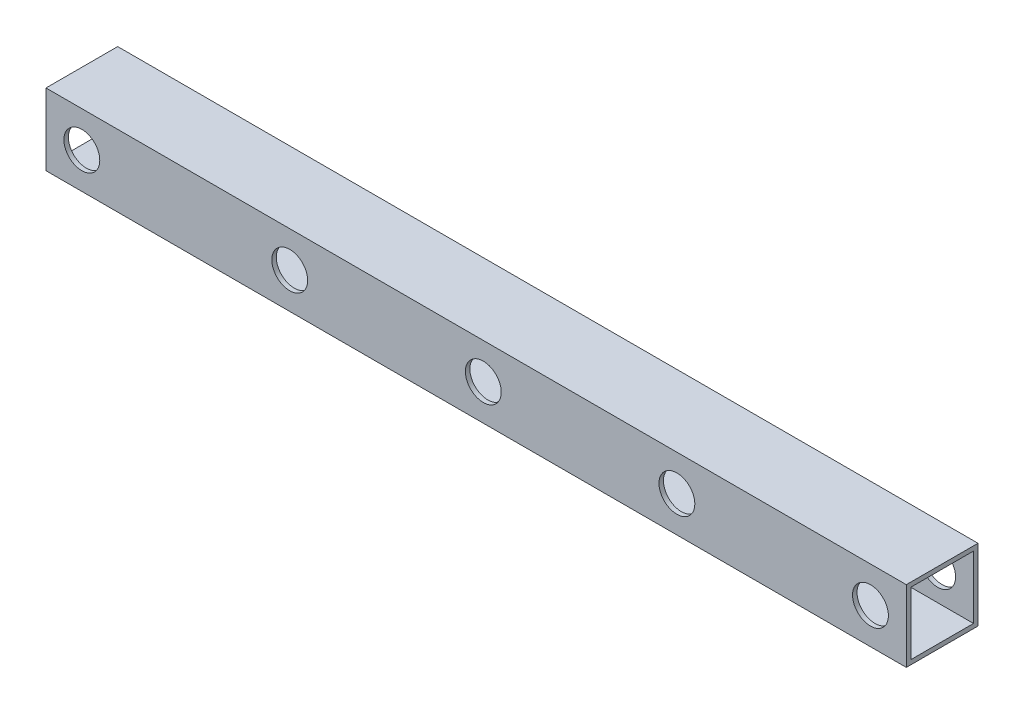
ISO-10303-21;
HEADER;
FILE_DESCRIPTION(('STEP AP214'),'2;1');
FILE_NAME('part.step','',(''),(''),'','','');
FILE_SCHEMA(('AUTOMOTIVE_DESIGN { 1 0 10303 214 1 1 1 1 }'));
ENDSEC;
DATA;
#1=APPLICATION_CONTEXT('core data for automotive mechanical design processes');
#2=APPLICATION_PROTOCOL_DEFINITION('international standard','automotive_design',2000,#1);
#3=PRODUCT_CONTEXT('',#1,'mechanical');
#4=PRODUCT('Part','Part','',(#3));
#5=PRODUCT_RELATED_PRODUCT_CATEGORY('part','',(#4));
#6=PRODUCT_DEFINITION_FORMATION('','',#4);
#7=PRODUCT_DEFINITION_CONTEXT('part definition',#1,'design');
#8=PRODUCT_DEFINITION('design','',#6,#7);
#9=PRODUCT_DEFINITION_SHAPE('','',#8);
#10=(LENGTH_UNIT() NAMED_UNIT(*) SI_UNIT(.MILLI.,.METRE.));
#11=(NAMED_UNIT(*) PLANE_ANGLE_UNIT() SI_UNIT($,.RADIAN.));
#12=(NAMED_UNIT(*) SI_UNIT($,.STERADIAN.) SOLID_ANGLE_UNIT());
#13=UNCERTAINTY_MEASURE_WITH_UNIT(LENGTH_MEASURE(1.E-05),#10,'distance_accuracy_value','');
#14=(GEOMETRIC_REPRESENTATION_CONTEXT(3) GLOBAL_UNCERTAINTY_ASSIGNED_CONTEXT((#13)) GLOBAL_UNIT_ASSIGNED_CONTEXT((#10,
#11,#12)) REPRESENTATION_CONTEXT('',''));
#15=CARTESIAN_POINT('',(0.,0.,0.));
#16=DIRECTION('',(0.,0.,1.));
#17=DIRECTION('',(1.,0.,0.));
#18=AXIS2_PLACEMENT_3D('',#15,#16,#17);
#19=CARTESIAN_POINT('',(304.8,-1.5875,-23.8125));
#20=DIRECTION('',(0.,0.,-1.));
#21=DIRECTION('',(-1.,0.,0.));
#22=AXIS2_PLACEMENT_3D('',#19,#20,#21);
#23=PLANE('',#22);
#24=CARTESIAN_POINT('',(154.94,-12.7,-23.8125));
#25=DIRECTION('',(0.,0.,1.));
#26=DIRECTION('',(1.,0.,0.));
#27=AXIS2_PLACEMENT_3D('',#24,#25,#26);
#28=CIRCLE('',#27,6.35000000000002);
#29=CARTESIAN_POINT('',(161.29,-12.7,-23.8125));
#30=VERTEX_POINT('',#29);
#31=EDGE_CURVE('E395',#30,#30,#28,.T.);
#32=ORIENTED_EDGE('',*,*,#31,.F.);
#33=EDGE_LOOP('',(#32));
#34=FACE_BOUND('',#33,.T.);
#35=CARTESIAN_POINT('',(223.52,-12.7,-23.8125));
#36=DIRECTION('',(0.,0.,1.));
#37=DIRECTION('',(1.,0.,0.));
#38=AXIS2_PLACEMENT_3D('',#35,#36,#37);
#39=CIRCLE('',#38,6.35000000000005);
#40=CARTESIAN_POINT('',(229.87,-12.7,-23.8125));
#41=VERTEX_POINT('',#40);
#42=EDGE_CURVE('E401',#41,#41,#39,.T.);
#43=ORIENTED_EDGE('',*,*,#42,.F.);
#44=EDGE_LOOP('',(#43));
#45=FACE_BOUND('',#44,.T.);
#46=CARTESIAN_POINT('',(292.1,-12.7,-23.8125));
#47=DIRECTION('',(0.,0.,1.));
#48=DIRECTION('',(1.,0.,0.));
#49=AXIS2_PLACEMENT_3D('',#46,#47,#48);
#50=CIRCLE('',#49,6.35000000000002);
#51=CARTESIAN_POINT('',(298.45,-12.7,-23.8125));
#52=VERTEX_POINT('',#51);
#53=EDGE_CURVE('E419',#52,#52,#50,.T.);
#54=ORIENTED_EDGE('',*,*,#53,.F.);
#55=EDGE_LOOP('',(#54));
#56=FACE_BOUND('',#55,.T.);
#57=CARTESIAN_POINT('',(12.7,-12.7,-23.8125));
#58=DIRECTION('',(0.,0.,1.));
#59=DIRECTION('',(1.,0.,0.));
#60=AXIS2_PLACEMENT_3D('',#57,#58,#59);
#61=CIRCLE('',#60,6.35000000000004);
#62=CARTESIAN_POINT('',(19.05,-12.7,-23.8125));
#63=VERTEX_POINT('',#62);
#64=EDGE_CURVE('E424',#63,#63,#61,.T.);
#65=ORIENTED_EDGE('',*,*,#64,.F.);
#66=EDGE_LOOP('',(#65));
#67=FACE_BOUND('',#66,.T.);
#68=DIRECTION('',(0.,-1.,0.));
#69=VECTOR('',#68,1.);
#70=CARTESIAN_POINT('',(0.,-1.5875,-23.8125));
#71=LINE('',#70,#69);
#72=CARTESIAN_POINT('',(0.,-1.5875,-23.8125));
#73=VERTEX_POINT('',#72);
#74=CARTESIAN_POINT('',(0.,-23.8125,-23.8125));
#75=VERTEX_POINT('',#74);
#76=EDGE_CURVE('E120',#73,#75,#71,.T.);
#77=ORIENTED_EDGE('',*,*,#76,.T.);
#78=DIRECTION('',(-1.,0.,0.));
#79=VECTOR('',#78,1.);
#80=CARTESIAN_POINT('',(304.8,-23.8125,-23.8125));
#81=LINE('',#80,#79);
#82=CARTESIAN_POINT('',(304.8,-23.8125,-23.8125));
#83=VERTEX_POINT('',#82);
#84=EDGE_CURVE('E136',#83,#75,#81,.T.);
#85=ORIENTED_EDGE('',*,*,#84,.F.);
#86=DIRECTION('',(0.,-1.,0.));
#87=VECTOR('',#86,1.);
#88=CARTESIAN_POINT('',(304.8,-1.5875,-23.8125));
#89=LINE('',#88,#87);
#90=CARTESIAN_POINT('',(304.8,-1.5875,-23.8125));
#91=VERTEX_POINT('',#90);
#92=EDGE_CURVE('E58',#91,#83,#89,.T.);
#93=ORIENTED_EDGE('',*,*,#92,.F.);
#94=DIRECTION('',(-1.,0.,0.));
#95=VECTOR('',#94,1.);
#96=CARTESIAN_POINT('',(304.8,-1.5875,-23.8125));
#97=LINE('',#96,#95);
#98=EDGE_CURVE('E106',#91,#73,#97,.T.);
#99=ORIENTED_EDGE('',*,*,#98,.T.);
#100=EDGE_LOOP('',(#77,#85,#93,#99));
#101=FACE_BOUND('',#100,.T.);
#102=CARTESIAN_POINT('',(86.36,-12.7,-23.8125));
#103=DIRECTION('',(0.,0.,1.));
#104=DIRECTION('',(1.,0.,0.));
#105=AXIS2_PLACEMENT_3D('',#102,#103,#104);
#106=CIRCLE('',#105,6.35000000000004);
#107=CARTESIAN_POINT('',(92.7100000000001,-12.7,-23.8125));
#108=VERTEX_POINT('',#107);
#109=EDGE_CURVE('E389',#108,#108,#106,.T.);
#110=ORIENTED_EDGE('',*,*,#109,.F.);
#111=EDGE_LOOP('',(#110));
#112=FACE_BOUND('',#111,.T.);
#113=ADVANCED_FACE('F33',(#34,#45,#56,#67,#101,#112),#23,.F.);
#114=CARTESIAN_POINT('',(0.,-25.4,-25.4));
#115=DIRECTION('',(-1.,0.,0.));
#116=DIRECTION('',(0.,0.,1.));
#117=AXIS2_PLACEMENT_3D('',#114,#115,#116);
#118=PLANE('',#117);
#119=DIRECTION('',(0.,1.,0.));
#120=VECTOR('',#119,1.);
#121=CARTESIAN_POINT('',(0.,-23.8125,-1.58750000000001));
#122=LINE('',#121,#120);
#123=CARTESIAN_POINT('',(0.,-23.8125,-1.58750000000001));
#124=VERTEX_POINT('',#123);
#125=CARTESIAN_POINT('',(0.,-1.5875,-1.58750000000001));
#126=VERTEX_POINT('',#125);
#127=EDGE_CURVE('E50',#124,#126,#122,.T.);
#128=ORIENTED_EDGE('',*,*,#127,.F.);
#129=DIRECTION('',(0.,0.,1.));
#130=VECTOR('',#129,1.);
#131=CARTESIAN_POINT('',(0.,-23.8125,-23.8125));
#132=LINE('',#131,#130);
#133=EDGE_CURVE('E117',#75,#124,#132,.T.);
#134=ORIENTED_EDGE('',*,*,#133,.F.);
#135=ORIENTED_EDGE('',*,*,#76,.F.);
#136=DIRECTION('',(0.,0.,-1.));
#137=VECTOR('',#136,1.);
#138=CARTESIAN_POINT('',(0.,-1.5875,-1.58750000000001));
#139=LINE('',#138,#137);
#140=EDGE_CURVE('E129',#126,#73,#139,.T.);
#141=ORIENTED_EDGE('',*,*,#140,.F.);
#142=EDGE_LOOP('',(#128,#134,#135,#141));
#143=FACE_BOUND('',#142,.T.);
#144=DIRECTION('',(0.,0.,1.));
#145=VECTOR('',#144,1.);
#146=CARTESIAN_POINT('',(0.,0.,-25.4));
#147=LINE('',#146,#145);
#148=CARTESIAN_POINT('',(0.,0.,-25.4));
#149=VERTEX_POINT('',#148);
#150=CARTESIAN_POINT('',(0.,0.,0.));
#151=VERTEX_POINT('',#150);
#152=EDGE_CURVE('E135',#149,#151,#147,.T.);
#153=ORIENTED_EDGE('',*,*,#152,.F.);
#154=DIRECTION('',(0.,1.,0.));
#155=VECTOR('',#154,1.);
#156=CARTESIAN_POINT('',(0.,-25.4,-25.4));
#157=LINE('',#156,#155);
#158=CARTESIAN_POINT('',(0.,-25.4,-25.4));
#159=VERTEX_POINT('',#158);
#160=EDGE_CURVE('E11',#159,#149,#157,.T.);
#161=ORIENTED_EDGE('',*,*,#160,.F.);
#162=DIRECTION('',(0.,0.,1.));
#163=VECTOR('',#162,1.);
#164=CARTESIAN_POINT('',(0.,-25.4,-25.4));
#165=LINE('',#164,#163);
#166=CARTESIAN_POINT('',(0.,-25.4,0.));
#167=VERTEX_POINT('',#166);
#168=EDGE_CURVE('E139',#159,#167,#165,.T.);
#169=ORIENTED_EDGE('',*,*,#168,.T.);
#170=DIRECTION('',(0.,1.,0.));
#171=VECTOR('',#170,1.);
#172=CARTESIAN_POINT('',(0.,-25.4,0.));
#173=LINE('',#172,#171);
#174=EDGE_CURVE('E37',#167,#151,#173,.T.);
#175=ORIENTED_EDGE('',*,*,#174,.T.);
#176=EDGE_LOOP('',(#153,#161,#169,#175));
#177=FACE_BOUND('',#176,.T.);
#178=ADVANCED_FACE('F35',(#143,#177),#118,.T.);
#179=CARTESIAN_POINT('',(304.8,-25.4,-25.4));
#180=DIRECTION('',(0.,0.,-1.));
#181=DIRECTION('',(-1.,0.,0.));
#182=AXIS2_PLACEMENT_3D('',#179,#180,#181);
#183=PLANE('',#182);
#184=CARTESIAN_POINT('',(86.36,-12.7,-25.4));
#185=DIRECTION('',(0.,0.,1.));
#186=DIRECTION('',(1.,0.,0.));
#187=AXIS2_PLACEMENT_3D('',#184,#185,#186);
#188=CIRCLE('',#187,6.35000000000004);
#189=CARTESIAN_POINT('',(92.7100000000001,-12.7,-25.4));
#190=VERTEX_POINT('',#189);
#191=EDGE_CURVE('E392',#190,#190,#188,.T.);
#192=ORIENTED_EDGE('',*,*,#191,.T.);
#193=EDGE_LOOP('',(#192));
#194=FACE_BOUND('',#193,.T.);
#195=CARTESIAN_POINT('',(154.94,-12.7,-25.4));
#196=DIRECTION('',(0.,0.,1.));
#197=DIRECTION('',(1.,0.,0.));
#198=AXIS2_PLACEMENT_3D('',#195,#196,#197);
#199=CIRCLE('',#198,6.35000000000002);
#200=CARTESIAN_POINT('',(161.29,-12.7,-25.4));
#201=VERTEX_POINT('',#200);
#202=EDGE_CURVE('E398',#201,#201,#199,.T.);
#203=ORIENTED_EDGE('',*,*,#202,.T.);
#204=EDGE_LOOP('',(#203));
#205=FACE_BOUND('',#204,.T.);
#206=CARTESIAN_POINT('',(223.52,-12.7,-25.4));
#207=DIRECTION('',(0.,0.,1.));
#208=DIRECTION('',(1.,0.,0.));
#209=AXIS2_PLACEMENT_3D('',#206,#207,#208);
#210=CIRCLE('',#209,6.35000000000005);
#211=CARTESIAN_POINT('',(229.87,-12.7,-25.4));
#212=VERTEX_POINT('',#211);
#213=EDGE_CURVE('E404',#212,#212,#210,.T.);
#214=ORIENTED_EDGE('',*,*,#213,.T.);
#215=EDGE_LOOP('',(#214));
#216=FACE_BOUND('',#215,.T.);
#217=CARTESIAN_POINT('',(292.1,-12.7,-25.4));
#218=DIRECTION('',(0.,0.,1.));
#219=DIRECTION('',(1.,0.,0.));
#220=AXIS2_PLACEMENT_3D('',#217,#218,#219);
#221=CIRCLE('',#220,6.35000000000002);
#222=CARTESIAN_POINT('',(298.45,-12.7,-25.4));
#223=VERTEX_POINT('',#222);
#224=EDGE_CURVE('E422',#223,#223,#221,.T.);
#225=ORIENTED_EDGE('',*,*,#224,.T.);
#226=EDGE_LOOP('',(#225));
#227=FACE_BOUND('',#226,.T.);
#228=CARTESIAN_POINT('',(12.7,-12.7,-25.4));
#229=DIRECTION('',(0.,0.,1.));
#230=DIRECTION('',(1.,0.,0.));
#231=AXIS2_PLACEMENT_3D('',#228,#229,#230);
#232=CIRCLE('',#231,6.35000000000004);
#233=CARTESIAN_POINT('',(19.05,-12.7,-25.4));
#234=VERTEX_POINT('',#233);
#235=EDGE_CURVE('E123',#234,#234,#232,.T.);
#236=ORIENTED_EDGE('',*,*,#235,.T.);
#237=EDGE_LOOP('',(#236));
#238=FACE_BOUND('',#237,.T.);
#239=DIRECTION('',(-1.,0.,0.));
#240=VECTOR('',#239,1.);
#241=CARTESIAN_POINT('',(304.8,0.,-25.4));
#242=LINE('',#241,#240);
#243=CARTESIAN_POINT('',(304.8,0.,-25.4));
#244=VERTEX_POINT('',#243);
#245=EDGE_CURVE('E143',#244,#149,#242,.T.);
#246=ORIENTED_EDGE('',*,*,#245,.F.);
#247=DIRECTION('',(0.,1.,0.));
#248=VECTOR('',#247,1.);
#249=CARTESIAN_POINT('',(304.8,-25.4,-25.4));
#250=LINE('',#249,#248);
#251=CARTESIAN_POINT('',(304.8,-25.4,-25.4));
#252=VERTEX_POINT('',#251);
#253=EDGE_CURVE('E42',#252,#244,#250,.T.);
#254=ORIENTED_EDGE('',*,*,#253,.F.);
#255=DIRECTION('',(-1.,0.,0.));
#256=VECTOR('',#255,1.);
#257=CARTESIAN_POINT('',(304.8,-25.4,-25.4));
#258=LINE('',#257,#256);
#259=EDGE_CURVE('E149',#252,#159,#258,.T.);
#260=ORIENTED_EDGE('',*,*,#259,.T.);
#261=ORIENTED_EDGE('',*,*,#160,.T.);
#262=EDGE_LOOP('',(#246,#254,#260,#261));
#263=FACE_BOUND('',#262,.T.);
#264=ADVANCED_FACE('F175',(#194,#205,#216,#227,#238,#263),#183,.T.);
#265=CARTESIAN_POINT('',(304.8,-25.4,0.));
#266=DIRECTION('',(1.,0.,0.));
#267=DIRECTION('',(0.,0.,-1.));
#268=AXIS2_PLACEMENT_3D('',#265,#266,#267);
#269=PLANE('',#268);
#270=DIRECTION('',(0.,1.,0.));
#271=VECTOR('',#270,1.);
#272=CARTESIAN_POINT('',(304.8,-23.8125,-1.58750000000001));
#273=LINE('',#272,#271);
#274=CARTESIAN_POINT('',(304.8,-23.8125,-1.58750000000001));
#275=VERTEX_POINT('',#274);
#276=CARTESIAN_POINT('',(304.8,-1.5875,-1.58750000000001));
#277=VERTEX_POINT('',#276);
#278=EDGE_CURVE('E101',#275,#277,#273,.T.);
#279=ORIENTED_EDGE('',*,*,#278,.T.);
#280=DIRECTION('',(0.,0.,-1.));
#281=VECTOR('',#280,1.);
#282=CARTESIAN_POINT('',(304.8,-1.5875,-1.58750000000001));
#283=LINE('',#282,#281);
#284=EDGE_CURVE('E110',#277,#91,#283,.T.);
#285=ORIENTED_EDGE('',*,*,#284,.T.);
#286=ORIENTED_EDGE('',*,*,#92,.T.);
#287=DIRECTION('',(0.,0.,1.));
#288=VECTOR('',#287,1.);
#289=CARTESIAN_POINT('',(304.8,-23.8125,-23.8125));
#290=LINE('',#289,#288);
#291=EDGE_CURVE('E107',#83,#275,#290,.T.);
#292=ORIENTED_EDGE('',*,*,#291,.T.);
#293=EDGE_LOOP('',(#279,#285,#286,#292));
#294=FACE_BOUND('',#293,.T.);
#295=DIRECTION('',(0.,0.,-1.));
#296=VECTOR('',#295,1.);
#297=CARTESIAN_POINT('',(304.8,0.,0.));
#298=LINE('',#297,#296);
#299=CARTESIAN_POINT('',(304.8,0.,0.));
#300=VERTEX_POINT('',#299);
#301=EDGE_CURVE('E157',#300,#244,#298,.T.);
#302=ORIENTED_EDGE('',*,*,#301,.F.);
#303=DIRECTION('',(0.,1.,0.));
#304=VECTOR('',#303,1.);
#305=CARTESIAN_POINT('',(304.8,-25.4,0.));
#306=LINE('',#305,#304);
#307=CARTESIAN_POINT('',(304.8,-25.4,0.));
#308=VERTEX_POINT('',#307);
#309=EDGE_CURVE('E162',#308,#300,#306,.T.);
#310=ORIENTED_EDGE('',*,*,#309,.F.);
#311=DIRECTION('',(0.,0.,-1.));
#312=VECTOR('',#311,1.);
#313=CARTESIAN_POINT('',(304.8,-25.4,0.));
#314=LINE('',#313,#312);
#315=EDGE_CURVE('E146',#308,#252,#314,.T.);
#316=ORIENTED_EDGE('',*,*,#315,.T.);
#317=ORIENTED_EDGE('',*,*,#253,.T.);
#318=EDGE_LOOP('',(#302,#310,#316,#317));
#319=FACE_BOUND('',#318,.T.);
#320=ADVANCED_FACE('F114',(#294,#319),#269,.T.);
#321=CARTESIAN_POINT('',(0.,-25.4,0.));
#322=DIRECTION('',(0.,0.,1.));
#323=DIRECTION('',(1.,0.,0.));
#324=AXIS2_PLACEMENT_3D('',#321,#322,#323);
#325=PLANE('',#324);
#326=CARTESIAN_POINT('',(86.36,-12.7,0.));
#327=DIRECTION('',(0.,0.,1.));
#328=DIRECTION('',(1.,0.,0.));
#329=AXIS2_PLACEMENT_3D('',#326,#327,#328);
#330=CIRCLE('',#329,6.35000000000004);
#331=CARTESIAN_POINT('',(92.7100000000001,-12.7,0.));
#332=VERTEX_POINT('',#331);
#333=EDGE_CURVE('E370',#332,#332,#330,.T.);
#334=ORIENTED_EDGE('',*,*,#333,.F.);
#335=EDGE_LOOP('',(#334));
#336=FACE_BOUND('',#335,.T.);
#337=CARTESIAN_POINT('',(154.94,-12.7,0.));
#338=DIRECTION('',(0.,0.,1.));
#339=DIRECTION('',(1.,0.,0.));
#340=AXIS2_PLACEMENT_3D('',#337,#338,#339);
#341=CIRCLE('',#340,6.35000000000002);
#342=CARTESIAN_POINT('',(161.29,-12.7,0.));
#343=VERTEX_POINT('',#342);
#344=EDGE_CURVE('E377',#343,#343,#341,.T.);
#345=ORIENTED_EDGE('',*,*,#344,.F.);
#346=EDGE_LOOP('',(#345));
#347=FACE_BOUND('',#346,.T.);
#348=CARTESIAN_POINT('',(223.52,-12.7,0.));
#349=DIRECTION('',(0.,0.,1.));
#350=DIRECTION('',(1.,0.,0.));
#351=AXIS2_PLACEMENT_3D('',#348,#349,#350);
#352=CIRCLE('',#351,6.35000000000004);
#353=CARTESIAN_POINT('',(229.87,-12.7,0.));
#354=VERTEX_POINT('',#353);
#355=EDGE_CURVE('E386',#354,#354,#352,.T.);
#356=ORIENTED_EDGE('',*,*,#355,.F.);
#357=EDGE_LOOP('',(#356));
#358=FACE_BOUND('',#357,.T.);
#359=CARTESIAN_POINT('',(292.1,-12.7,0.));
#360=DIRECTION('',(0.,0.,1.));
#361=DIRECTION('',(1.,0.,0.));
#362=AXIS2_PLACEMENT_3D('',#359,#360,#361);
#363=CIRCLE('',#362,6.35000000000002);
#364=CARTESIAN_POINT('',(298.45,-12.7,0.));
#365=VERTEX_POINT('',#364);
#366=EDGE_CURVE('E407',#365,#365,#363,.T.);
#367=ORIENTED_EDGE('',*,*,#366,.F.);
#368=EDGE_LOOP('',(#367));
#369=FACE_BOUND('',#368,.T.);
#370=CARTESIAN_POINT('',(12.7,-12.7,0.));
#371=DIRECTION('',(0.,0.,1.));
#372=DIRECTION('',(1.,0.,0.));
#373=AXIS2_PLACEMENT_3D('',#370,#371,#372);
#374=CIRCLE('',#373,6.35000000000004);
#375=CARTESIAN_POINT('',(19.05,-12.7,0.));
#376=VERTEX_POINT('',#375);
#377=EDGE_CURVE('E413',#376,#376,#374,.T.);
#378=ORIENTED_EDGE('',*,*,#377,.F.);
#379=EDGE_LOOP('',(#378));
#380=FACE_BOUND('',#379,.T.);
#381=DIRECTION('',(1.,0.,0.));
#382=VECTOR('',#381,1.);
#383=CARTESIAN_POINT('',(0.,0.,0.));
#384=LINE('',#383,#382);
#385=EDGE_CURVE('E154',#151,#300,#384,.T.);
#386=ORIENTED_EDGE('',*,*,#385,.F.);
#387=ORIENTED_EDGE('',*,*,#174,.F.);
#388=DIRECTION('',(1.,0.,0.));
#389=VECTOR('',#388,1.);
#390=CARTESIAN_POINT('',(0.,-25.4,0.));
#391=LINE('',#390,#389);
#392=EDGE_CURVE('E142',#167,#308,#391,.T.);
#393=ORIENTED_EDGE('',*,*,#392,.T.);
#394=ORIENTED_EDGE('',*,*,#309,.T.);
#395=EDGE_LOOP('',(#386,#387,#393,#394));
#396=FACE_BOUND('',#395,.T.);
#397=ADVANCED_FACE('F170',(#336,#347,#358,#369,#380,#396),#325,.T.);
#398=CARTESIAN_POINT('',(0.,-25.4,0.));
#399=DIRECTION('',(0.,1.,0.));
#400=DIRECTION('',(0.,0.,1.));
#401=AXIS2_PLACEMENT_3D('',#398,#399,#400);
#402=PLANE('',#401);
#403=ORIENTED_EDGE('',*,*,#168,.F.);
#404=ORIENTED_EDGE('',*,*,#259,.F.);
#405=ORIENTED_EDGE('',*,*,#315,.F.);
#406=ORIENTED_EDGE('',*,*,#392,.F.);
#407=EDGE_LOOP('',(#403,#404,#405,#406));
#408=FACE_BOUND('',#407,.T.);
#409=ADVANCED_FACE('F178',(#408),#402,.F.);
#410=CARTESIAN_POINT('',(0.,0.,0.));
#411=DIRECTION('',(0.,1.,0.));
#412=DIRECTION('',(0.,0.,1.));
#413=AXIS2_PLACEMENT_3D('',#410,#411,#412);
#414=PLANE('',#413);
#415=ORIENTED_EDGE('',*,*,#152,.T.);
#416=ORIENTED_EDGE('',*,*,#385,.T.);
#417=ORIENTED_EDGE('',*,*,#301,.T.);
#418=ORIENTED_EDGE('',*,*,#245,.T.);
#419=EDGE_LOOP('',(#415,#416,#417,#418));
#420=FACE_BOUND('',#419,.T.);
#421=ADVANCED_FACE('F172',(#420),#414,.T.);
#422=CARTESIAN_POINT('',(304.8,-23.8125,-1.58750000000001));
#423=DIRECTION('',(0.,0.,1.));
#424=DIRECTION('',(0.,-1.,0.));
#425=AXIS2_PLACEMENT_3D('',#422,#423,#424);
#426=PLANE('',#425);
#427=CARTESIAN_POINT('',(86.36,-12.7,-1.58750000000001));
#428=DIRECTION('',(0.,0.,1.));
#429=DIRECTION('',(0.,-1.,0.));
#430=AXIS2_PLACEMENT_3D('',#427,#428,#429);
#431=CIRCLE('',#430,6.35000000000004);
#432=CARTESIAN_POINT('',(86.36,-19.05,-1.58750000000001));
#433=VERTEX_POINT('',#432);
#434=EDGE_CURVE('E373',#433,#433,#431,.T.);
#435=ORIENTED_EDGE('',*,*,#434,.T.);
#436=EDGE_LOOP('',(#435));
#437=FACE_BOUND('',#436,.T.);
#438=CARTESIAN_POINT('',(154.94,-12.7,-1.58750000000001));
#439=DIRECTION('',(0.,0.,1.));
#440=DIRECTION('',(0.,-1.,0.));
#441=AXIS2_PLACEMENT_3D('',#438,#439,#440);
#442=CIRCLE('',#441,6.35000000000002);
#443=CARTESIAN_POINT('',(154.94,-19.05,-1.58750000000001));
#444=VERTEX_POINT('',#443);
#445=EDGE_CURVE('E374',#444,#444,#442,.T.);
#446=ORIENTED_EDGE('',*,*,#445,.T.);
#447=EDGE_LOOP('',(#446));
#448=FACE_BOUND('',#447,.T.);
#449=CARTESIAN_POINT('',(223.52,-12.7,-1.58750000000001));
#450=DIRECTION('',(0.,0.,1.));
#451=DIRECTION('',(0.,-1.,0.));
#452=AXIS2_PLACEMENT_3D('',#449,#450,#451);
#453=CIRCLE('',#452,6.35000000000004);
#454=CARTESIAN_POINT('',(223.52,-19.05,-1.58750000000001));
#455=VERTEX_POINT('',#454);
#456=EDGE_CURVE('E383',#455,#455,#453,.T.);
#457=ORIENTED_EDGE('',*,*,#456,.T.);
#458=EDGE_LOOP('',(#457));
#459=FACE_BOUND('',#458,.T.);
#460=CARTESIAN_POINT('',(292.1,-12.7,-1.58750000000001));
#461=DIRECTION('',(0.,0.,1.));
#462=DIRECTION('',(0.,-1.,0.));
#463=AXIS2_PLACEMENT_3D('',#460,#461,#462);
#464=CIRCLE('',#463,6.35000000000002);
#465=CARTESIAN_POINT('',(292.1,-19.05,-1.58750000000001));
#466=VERTEX_POINT('',#465);
#467=EDGE_CURVE('E410',#466,#466,#464,.T.);
#468=ORIENTED_EDGE('',*,*,#467,.T.);
#469=EDGE_LOOP('',(#468));
#470=FACE_BOUND('',#469,.T.);
#471=CARTESIAN_POINT('',(12.7,-12.7,-1.58750000000001));
#472=DIRECTION('',(0.,0.,1.));
#473=DIRECTION('',(0.,-1.,0.));
#474=AXIS2_PLACEMENT_3D('',#471,#472,#473);
#475=CIRCLE('',#474,6.35000000000003);
#476=CARTESIAN_POINT('',(12.7,-19.05,-1.58750000000001));
#477=VERTEX_POINT('',#476);
#478=EDGE_CURVE('E416',#477,#477,#475,.T.);
#479=ORIENTED_EDGE('',*,*,#478,.T.);
#480=EDGE_LOOP('',(#479));
#481=FACE_BOUND('',#480,.T.);
#482=ORIENTED_EDGE('',*,*,#127,.T.);
#483=DIRECTION('',(-1.,0.,0.));
#484=VECTOR('',#483,1.);
#485=CARTESIAN_POINT('',(304.8,-1.5875,-1.58750000000001));
#486=LINE('',#485,#484);
#487=EDGE_CURVE('E97',#277,#126,#486,.T.);
#488=ORIENTED_EDGE('',*,*,#487,.F.);
#489=ORIENTED_EDGE('',*,*,#278,.F.);
#490=DIRECTION('',(-1.,0.,0.));
#491=VECTOR('',#490,1.);
#492=CARTESIAN_POINT('',(304.8,-23.8125,-1.58750000000001));
#493=LINE('',#492,#491);
#494=EDGE_CURVE('E133',#275,#124,#493,.T.);
#495=ORIENTED_EDGE('',*,*,#494,.T.);
#496=EDGE_LOOP('',(#482,#488,#489,#495));
#497=FACE_BOUND('',#496,.T.);
#498=ADVANCED_FACE('F99',(#437,#448,#459,#470,#481,#497),#426,.F.);
#499=CARTESIAN_POINT('',(304.8,-23.8125,-23.8125));
#500=DIRECTION('',(0.,-1.,0.));
#501=DIRECTION('',(0.,0.,-1.));
#502=AXIS2_PLACEMENT_3D('',#499,#500,#501);
#503=PLANE('',#502);
#504=ORIENTED_EDGE('',*,*,#133,.T.);
#505=ORIENTED_EDGE('',*,*,#494,.F.);
#506=ORIENTED_EDGE('',*,*,#291,.F.);
#507=ORIENTED_EDGE('',*,*,#84,.T.);
#508=EDGE_LOOP('',(#504,#505,#506,#507));
#509=FACE_BOUND('',#508,.T.);
#510=ADVANCED_FACE('F200',(#509),#503,.F.);
#511=CARTESIAN_POINT('',(304.8,-1.5875,-1.58750000000001));
#512=DIRECTION('',(0.,1.,0.));
#513=DIRECTION('',(0.,0.,1.));
#514=AXIS2_PLACEMENT_3D('',#511,#512,#513);
#515=PLANE('',#514);
#516=ORIENTED_EDGE('',*,*,#140,.T.);
#517=ORIENTED_EDGE('',*,*,#98,.F.);
#518=ORIENTED_EDGE('',*,*,#284,.F.);
#519=ORIENTED_EDGE('',*,*,#487,.T.);
#520=EDGE_LOOP('',(#516,#517,#518,#519));
#521=FACE_BOUND('',#520,.T.);
#522=ADVANCED_FACE('F111',(#521),#515,.F.);
#523=CARTESIAN_POINT('',(12.7,-12.7,-23.8125));
#524=DIRECTION('',(0.,0.,1.));
#525=DIRECTION('',(1.,0.,0.));
#526=AXIS2_PLACEMENT_3D('',#523,#524,#525);
#527=CYLINDRICAL_SURFACE('',#526,6.35000000000004);
#528=ORIENTED_EDGE('',*,*,#235,.F.);
#529=EDGE_LOOP('',(#528));
#530=FACE_BOUND('',#529,.T.);
#531=ORIENTED_EDGE('',*,*,#64,.T.);
#532=EDGE_LOOP('',(#531));
#533=FACE_BOUND('',#532,.T.);
#534=ADVANCED_FACE('F204',(#530,#533),#527,.F.);
#535=CARTESIAN_POINT('',(292.1,-12.7,-23.8125));
#536=DIRECTION('',(0.,0.,1.));
#537=DIRECTION('',(1.,0.,0.));
#538=AXIS2_PLACEMENT_3D('',#535,#536,#537);
#539=CYLINDRICAL_SURFACE('',#538,6.35000000000002);
#540=ORIENTED_EDGE('',*,*,#224,.F.);
#541=EDGE_LOOP('',(#540));
#542=FACE_BOUND('',#541,.T.);
#543=ORIENTED_EDGE('',*,*,#53,.T.);
#544=EDGE_LOOP('',(#543));
#545=FACE_BOUND('',#544,.T.);
#546=ADVANCED_FACE('F238',(#542,#545),#539,.F.);
#547=CARTESIAN_POINT('',(12.7,-12.7,0.));
#548=DIRECTION('',(0.,0.,1.));
#549=DIRECTION('',(1.,0.,0.));
#550=AXIS2_PLACEMENT_3D('',#547,#548,#549);
#551=CYLINDRICAL_SURFACE('',#550,6.35000000000003);
#552=ORIENTED_EDGE('',*,*,#377,.T.);
#553=EDGE_LOOP('',(#552));
#554=FACE_BOUND('',#553,.T.);
#555=ORIENTED_EDGE('',*,*,#478,.F.);
#556=EDGE_LOOP('',(#555));
#557=FACE_BOUND('',#556,.T.);
#558=ADVANCED_FACE('F245',(#554,#557),#551,.F.);
#559=CARTESIAN_POINT('',(292.1,-12.7,0.));
#560=DIRECTION('',(0.,0.,1.));
#561=DIRECTION('',(1.,0.,0.));
#562=AXIS2_PLACEMENT_3D('',#559,#560,#561);
#563=CYLINDRICAL_SURFACE('',#562,6.35000000000002);
#564=ORIENTED_EDGE('',*,*,#366,.T.);
#565=EDGE_LOOP('',(#564));
#566=FACE_BOUND('',#565,.T.);
#567=ORIENTED_EDGE('',*,*,#467,.F.);
#568=EDGE_LOOP('',(#567));
#569=FACE_BOUND('',#568,.T.);
#570=ADVANCED_FACE('F253',(#566,#569),#563,.F.);
#571=CARTESIAN_POINT('',(223.52,-12.7,-23.8125));
#572=DIRECTION('',(0.,0.,1.));
#573=DIRECTION('',(1.,0.,0.));
#574=AXIS2_PLACEMENT_3D('',#571,#572,#573);
#575=CYLINDRICAL_SURFACE('',#574,6.35000000000005);
#576=ORIENTED_EDGE('',*,*,#213,.F.);
#577=EDGE_LOOP('',(#576));
#578=FACE_BOUND('',#577,.T.);
#579=ORIENTED_EDGE('',*,*,#42,.T.);
#580=EDGE_LOOP('',(#579));
#581=FACE_BOUND('',#580,.T.);
#582=ADVANCED_FACE('F261',(#578,#581),#575,.F.);
#583=CARTESIAN_POINT('',(154.94,-12.7,-23.8125));
#584=DIRECTION('',(0.,0.,1.));
#585=DIRECTION('',(1.,0.,0.));
#586=AXIS2_PLACEMENT_3D('',#583,#584,#585);
#587=CYLINDRICAL_SURFACE('',#586,6.35000000000002);
#588=ORIENTED_EDGE('',*,*,#202,.F.);
#589=EDGE_LOOP('',(#588));
#590=FACE_BOUND('',#589,.T.);
#591=ORIENTED_EDGE('',*,*,#31,.T.);
#592=EDGE_LOOP('',(#591));
#593=FACE_BOUND('',#592,.T.);
#594=ADVANCED_FACE('F268',(#590,#593),#587,.F.);
#595=CARTESIAN_POINT('',(86.36,-12.7,-23.8125));
#596=DIRECTION('',(0.,0.,1.));
#597=DIRECTION('',(1.,0.,0.));
#598=AXIS2_PLACEMENT_3D('',#595,#596,#597);
#599=CYLINDRICAL_SURFACE('',#598,6.35000000000004);
#600=ORIENTED_EDGE('',*,*,#191,.F.);
#601=EDGE_LOOP('',(#600));
#602=FACE_BOUND('',#601,.T.);
#603=ORIENTED_EDGE('',*,*,#109,.T.);
#604=EDGE_LOOP('',(#603));
#605=FACE_BOUND('',#604,.T.);
#606=ADVANCED_FACE('F276',(#602,#605),#599,.F.);
#607=CARTESIAN_POINT('',(223.52,-12.7,4.1275));
#608=DIRECTION('',(0.,0.,1.));
#609=DIRECTION('',(1.,0.,0.));
#610=AXIS2_PLACEMENT_3D('',#607,#608,#609);
#611=CYLINDRICAL_SURFACE('',#610,6.35000000000004);
#612=ORIENTED_EDGE('',*,*,#355,.T.);
#613=EDGE_LOOP('',(#612));
#614=FACE_BOUND('',#613,.T.);
#615=ORIENTED_EDGE('',*,*,#456,.F.);
#616=EDGE_LOOP('',(#615));
#617=FACE_BOUND('',#616,.T.);
#618=ADVANCED_FACE('F284',(#614,#617),#611,.F.);
#619=CARTESIAN_POINT('',(154.94,-12.7,4.1275));
#620=DIRECTION('',(0.,0.,1.));
#621=DIRECTION('',(1.,0.,0.));
#622=AXIS2_PLACEMENT_3D('',#619,#620,#621);
#623=CYLINDRICAL_SURFACE('',#622,6.35000000000002);
#624=ORIENTED_EDGE('',*,*,#344,.T.);
#625=EDGE_LOOP('',(#624));
#626=FACE_BOUND('',#625,.T.);
#627=ORIENTED_EDGE('',*,*,#445,.F.);
#628=EDGE_LOOP('',(#627));
#629=FACE_BOUND('',#628,.T.);
#630=ADVANCED_FACE('F292',(#626,#629),#623,.F.);
#631=CARTESIAN_POINT('',(86.36,-12.7,4.1275));
#632=DIRECTION('',(0.,0.,1.));
#633=DIRECTION('',(1.,0.,0.));
#634=AXIS2_PLACEMENT_3D('',#631,#632,#633);
#635=CYLINDRICAL_SURFACE('',#634,6.35000000000004);
#636=ORIENTED_EDGE('',*,*,#333,.T.);
#637=EDGE_LOOP('',(#636));
#638=FACE_BOUND('',#637,.T.);
#639=ORIENTED_EDGE('',*,*,#434,.F.);
#640=EDGE_LOOP('',(#639));
#641=FACE_BOUND('',#640,.T.);
#642=ADVANCED_FACE('F300',(#638,#641),#635,.F.);
#643=CLOSED_SHELL('',(#113,#178,#264,#320,#397,#409,#421,#498,#510,#522,#534,#546,#558,#570,
#582,#594,#606,#618,#630,#642));
#644=MANIFOLD_SOLID_BREP('B2',#643);
#645=ADVANCED_BREP_SHAPE_REPRESENTATION('',(#18,#644),#14);
#646=SHAPE_DEFINITION_REPRESENTATION(#9,#645);
ENDSEC;
END-ISO-10303-21;
